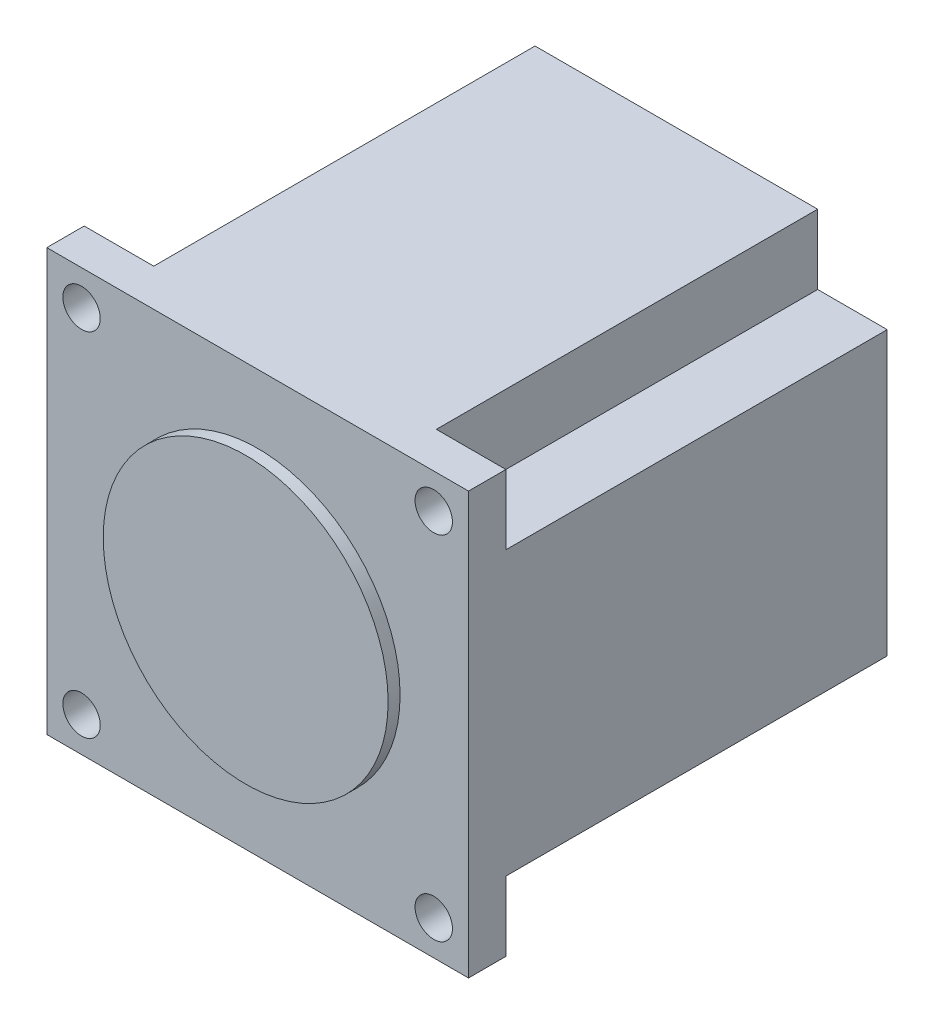
ISO-10303-21;
HEADER;
FILE_DESCRIPTION(('STEP AP214'),'2;1');
FILE_NAME('part.step','',(''),(''),'','','');
FILE_SCHEMA(('AUTOMOTIVE_DESIGN { 1 0 10303 214 1 1 1 1 }'));
ENDSEC;
DATA;
#1=APPLICATION_CONTEXT('core data for automotive mechanical design processes');
#2=APPLICATION_PROTOCOL_DEFINITION('international standard','automotive_design',2000,#1);
#3=PRODUCT_CONTEXT('',#1,'mechanical');
#4=PRODUCT('Part','Part','',(#3));
#5=PRODUCT_RELATED_PRODUCT_CATEGORY('part','',(#4));
#6=PRODUCT_DEFINITION_FORMATION('','',#4);
#7=PRODUCT_DEFINITION_CONTEXT('part definition',#1,'design');
#8=PRODUCT_DEFINITION('design','',#6,#7);
#9=PRODUCT_DEFINITION_SHAPE('','',#8);
#10=(LENGTH_UNIT() NAMED_UNIT(*) SI_UNIT(.MILLI.,.METRE.));
#11=(NAMED_UNIT(*) PLANE_ANGLE_UNIT() SI_UNIT($,.RADIAN.));
#12=(NAMED_UNIT(*) SI_UNIT($,.STERADIAN.) SOLID_ANGLE_UNIT());
#13=UNCERTAINTY_MEASURE_WITH_UNIT(LENGTH_MEASURE(1.E-05),#10,'distance_accuracy_value','');
#14=(GEOMETRIC_REPRESENTATION_CONTEXT(3) GLOBAL_UNCERTAINTY_ASSIGNED_CONTEXT((#13)) GLOBAL_UNIT_ASSIGNED_CONTEXT((#10,
#11,#12)) REPRESENTATION_CONTEXT('',''));
#15=CARTESIAN_POINT('',(0.,0.,0.));
#16=DIRECTION('',(0.,0.,1.));
#17=DIRECTION('',(1.,0.,0.));
#18=AXIS2_PLACEMENT_3D('',#15,#16,#17);
#19=CARTESIAN_POINT('',(-18.9,18.9,51.));
#20=DIRECTION('',(1.,0.,0.));
#21=DIRECTION('',(0.,1.,0.));
#22=AXIS2_PLACEMENT_3D('',#19,#20,#21);
#23=PLANE('',#22);
#24=DIRECTION('',(0.,-1.,0.));
#25=VECTOR('',#24,1.);
#26=CARTESIAN_POINT('',(-18.9,18.9,0.));
#27=LINE('',#26,#25);
#28=CARTESIAN_POINT('',(-18.9,28.2,0.));
#29=VERTEX_POINT('',#28);
#30=CARTESIAN_POINT('',(-18.9,18.9,0.));
#31=VERTEX_POINT('',#30);
#32=EDGE_CURVE('E193',#29,#31,#27,.T.);
#33=ORIENTED_EDGE('',*,*,#32,.T.);
#34=DIRECTION('',(0.,0.,-1.));
#35=VECTOR('',#34,1.);
#36=CARTESIAN_POINT('',(-18.9,18.9,51.));
#37=LINE('',#36,#35);
#38=CARTESIAN_POINT('',(-18.9,18.9,51.));
#39=VERTEX_POINT('',#38);
#40=EDGE_CURVE('E40',#39,#31,#37,.T.);
#41=ORIENTED_EDGE('',*,*,#40,.F.);
#42=DIRECTION('',(0.,-1.,0.));
#43=VECTOR('',#42,1.);
#44=CARTESIAN_POINT('',(-18.9,18.9,51.));
#45=LINE('',#44,#43);
#46=CARTESIAN_POINT('',(-18.9,28.2,51.));
#47=VERTEX_POINT('',#46);
#48=EDGE_CURVE('E194',#47,#39,#45,.T.);
#49=ORIENTED_EDGE('',*,*,#48,.F.);
#50=DIRECTION('',(0.,0.,-1.));
#51=VECTOR('',#50,1.);
#52=CARTESIAN_POINT('',(-18.9,28.2,51.));
#53=LINE('',#52,#51);
#54=EDGE_CURVE('E48',#47,#29,#53,.T.);
#55=ORIENTED_EDGE('',*,*,#54,.T.);
#56=EDGE_LOOP('',(#33,#41,#49,#55));
#57=FACE_BOUND('',#56,.T.);
#58=ADVANCED_FACE('F32',(#57),#23,.F.);
#59=CARTESIAN_POINT('',(-28.2,18.9,51.));
#60=DIRECTION('',(0.,-1.,0.));
#61=DIRECTION('',(0.,0.,-1.));
#62=AXIS2_PLACEMENT_3D('',#59,#60,#61);
#63=PLANE('',#62);
#64=DIRECTION('',(-1.,0.,0.));
#65=VECTOR('',#64,1.);
#66=CARTESIAN_POINT('',(-28.2,18.9,0.));
#67=LINE('',#66,#65);
#68=CARTESIAN_POINT('',(-28.2,18.9,0.));
#69=VERTEX_POINT('',#68);
#70=EDGE_CURVE('E212',#31,#69,#67,.T.);
#71=ORIENTED_EDGE('',*,*,#70,.T.);
#72=DIRECTION('',(0.,0.,-1.));
#73=VECTOR('',#72,1.);
#74=CARTESIAN_POINT('',(-28.2,18.9,51.));
#75=LINE('',#74,#73);
#76=CARTESIAN_POINT('',(-28.2,18.9,51.));
#77=VERTEX_POINT('',#76);
#78=EDGE_CURVE('E251',#77,#69,#75,.T.);
#79=ORIENTED_EDGE('',*,*,#78,.F.);
#80=DIRECTION('',(-1.,0.,0.));
#81=VECTOR('',#80,1.);
#82=CARTESIAN_POINT('',(-28.2,18.9,51.));
#83=LINE('',#82,#81);
#84=EDGE_CURVE('E103',#39,#77,#83,.T.);
#85=ORIENTED_EDGE('',*,*,#84,.F.);
#86=ORIENTED_EDGE('',*,*,#40,.T.);
#87=EDGE_LOOP('',(#71,#79,#85,#86));
#88=FACE_BOUND('',#87,.T.);
#89=ADVANCED_FACE('F253',(#88),#63,.F.);
#90=CARTESIAN_POINT('',(-28.2,-18.9,51.));
#91=DIRECTION('',(1.,0.,0.));
#92=DIRECTION('',(0.,0.,-1.));
#93=AXIS2_PLACEMENT_3D('',#90,#91,#92);
#94=PLANE('',#93);
#95=DIRECTION('',(0.,-1.,0.));
#96=VECTOR('',#95,1.);
#97=CARTESIAN_POINT('',(-28.2,-18.9,0.));
#98=LINE('',#97,#96);
#99=CARTESIAN_POINT('',(-28.2,-18.9,0.));
#100=VERTEX_POINT('',#99);
#101=EDGE_CURVE('E214',#69,#100,#98,.T.);
#102=ORIENTED_EDGE('',*,*,#101,.T.);
#103=DIRECTION('',(0.,0.,-1.));
#104=VECTOR('',#103,1.);
#105=CARTESIAN_POINT('',(-28.2,-18.9,51.));
#106=LINE('',#105,#104);
#107=CARTESIAN_POINT('',(-28.2,-18.9,51.));
#108=VERTEX_POINT('',#107);
#109=EDGE_CURVE('E248',#108,#100,#106,.T.);
#110=ORIENTED_EDGE('',*,*,#109,.F.);
#111=DIRECTION('',(0.,-1.,0.));
#112=VECTOR('',#111,1.);
#113=CARTESIAN_POINT('',(-28.2,-28.2,51.));
#114=LINE('',#113,#112);
#115=CARTESIAN_POINT('',(-28.2,-28.2,51.));
#116=VERTEX_POINT('',#115);
#117=EDGE_CURVE('E173',#108,#116,#114,.T.);
#118=ORIENTED_EDGE('',*,*,#117,.T.);
#119=DIRECTION('',(0.,0.,-1.));
#120=VECTOR('',#119,1.);
#121=CARTESIAN_POINT('',(-28.2,-28.2,56.));
#122=LINE('',#121,#120);
#123=CARTESIAN_POINT('',(-28.2,-28.2,56.));
#124=VERTEX_POINT('',#123);
#125=EDGE_CURVE('E185',#124,#116,#122,.T.);
#126=ORIENTED_EDGE('',*,*,#125,.F.);
#127=DIRECTION('',(0.,-1.,0.));
#128=VECTOR('',#127,1.);
#129=CARTESIAN_POINT('',(-28.2,-28.2,56.));
#130=LINE('',#129,#128);
#131=CARTESIAN_POINT('',(-28.2,28.2,56.));
#132=VERTEX_POINT('',#131);
#133=EDGE_CURVE('E292',#132,#124,#130,.T.);
#134=ORIENTED_EDGE('',*,*,#133,.F.);
#135=DIRECTION('',(0.,0.,-1.));
#136=VECTOR('',#135,1.);
#137=CARTESIAN_POINT('',(-28.2,28.2,56.));
#138=LINE('',#137,#136);
#139=CARTESIAN_POINT('',(-28.2,28.2,51.));
#140=VERTEX_POINT('',#139);
#141=EDGE_CURVE('E188',#132,#140,#138,.T.);
#142=ORIENTED_EDGE('',*,*,#141,.T.);
#143=EDGE_CURVE('E174',#140,#77,#114,.T.);
#144=ORIENTED_EDGE('',*,*,#143,.T.);
#145=ORIENTED_EDGE('',*,*,#78,.T.);
#146=EDGE_LOOP('',(#102,#110,#118,#126,#134,#142,#144,#145));
#147=FACE_BOUND('',#146,.T.);
#148=ADVANCED_FACE('F262',(#147),#94,.F.);
#149=CARTESIAN_POINT('',(-18.9,-18.9,51.));
#150=DIRECTION('',(0.,1.,0.));
#151=DIRECTION('',(0.,0.,1.));
#152=AXIS2_PLACEMENT_3D('',#149,#150,#151);
#153=PLANE('',#152);
#154=DIRECTION('',(1.,0.,0.));
#155=VECTOR('',#154,1.);
#156=CARTESIAN_POINT('',(-18.9,-18.9,0.));
#157=LINE('',#156,#155);
#158=CARTESIAN_POINT('',(-18.9,-18.9,0.));
#159=VERTEX_POINT('',#158);
#160=EDGE_CURVE('E216',#100,#159,#157,.T.);
#161=ORIENTED_EDGE('',*,*,#160,.T.);
#162=DIRECTION('',(0.,0.,-1.));
#163=VECTOR('',#162,1.);
#164=CARTESIAN_POINT('',(-18.9,-18.9,51.));
#165=LINE('',#164,#163);
#166=CARTESIAN_POINT('',(-18.9,-18.9,51.));
#167=VERTEX_POINT('',#166);
#168=EDGE_CURVE('E245',#167,#159,#165,.T.);
#169=ORIENTED_EDGE('',*,*,#168,.F.);
#170=DIRECTION('',(1.,0.,0.));
#171=VECTOR('',#170,1.);
#172=CARTESIAN_POINT('',(-18.9,-18.9,51.));
#173=LINE('',#172,#171);
#174=EDGE_CURVE('E198',#108,#167,#173,.T.);
#175=ORIENTED_EDGE('',*,*,#174,.F.);
#176=ORIENTED_EDGE('',*,*,#109,.T.);
#177=EDGE_LOOP('',(#161,#169,#175,#176));
#178=FACE_BOUND('',#177,.T.);
#179=ADVANCED_FACE('F266',(#178),#153,.F.);
#180=CARTESIAN_POINT('',(-18.9,-28.2,51.));
#181=DIRECTION('',(1.,0.,0.));
#182=DIRECTION('',(0.,0.,-1.));
#183=AXIS2_PLACEMENT_3D('',#180,#181,#182);
#184=PLANE('',#183);
#185=DIRECTION('',(0.,-1.,0.));
#186=VECTOR('',#185,1.);
#187=CARTESIAN_POINT('',(-18.9,-28.2,0.));
#188=LINE('',#187,#186);
#189=CARTESIAN_POINT('',(-18.9,-28.2,0.));
#190=VERTEX_POINT('',#189);
#191=EDGE_CURVE('E218',#159,#190,#188,.T.);
#192=ORIENTED_EDGE('',*,*,#191,.T.);
#193=DIRECTION('',(0.,0.,-1.));
#194=VECTOR('',#193,1.);
#195=CARTESIAN_POINT('',(-18.9,-28.2,51.));
#196=LINE('',#195,#194);
#197=CARTESIAN_POINT('',(-18.9,-28.2,51.));
#198=VERTEX_POINT('',#197);
#199=EDGE_CURVE('E242',#198,#190,#196,.T.);
#200=ORIENTED_EDGE('',*,*,#199,.F.);
#201=DIRECTION('',(0.,-1.,0.));
#202=VECTOR('',#201,1.);
#203=CARTESIAN_POINT('',(-18.9,-28.2,51.));
#204=LINE('',#203,#202);
#205=EDGE_CURVE('E201',#167,#198,#204,.T.);
#206=ORIENTED_EDGE('',*,*,#205,.F.);
#207=ORIENTED_EDGE('',*,*,#168,.T.);
#208=EDGE_LOOP('',(#192,#200,#206,#207));
#209=FACE_BOUND('',#208,.T.);
#210=ADVANCED_FACE('F372',(#209),#184,.F.);
#211=CARTESIAN_POINT('',(18.9,-28.2,51.));
#212=DIRECTION('',(0.,1.,0.));
#213=DIRECTION('',(0.,0.,1.));
#214=AXIS2_PLACEMENT_3D('',#211,#212,#213);
#215=PLANE('',#214);
#216=DIRECTION('',(1.,0.,0.));
#217=VECTOR('',#216,1.);
#218=CARTESIAN_POINT('',(18.9,-28.2,0.));
#219=LINE('',#218,#217);
#220=CARTESIAN_POINT('',(18.9,-28.2,0.));
#221=VERTEX_POINT('',#220);
#222=EDGE_CURVE('E220',#190,#221,#219,.T.);
#223=ORIENTED_EDGE('',*,*,#222,.T.);
#224=DIRECTION('',(0.,0.,-1.));
#225=VECTOR('',#224,1.);
#226=CARTESIAN_POINT('',(18.9,-28.2,51.));
#227=LINE('',#226,#225);
#228=CARTESIAN_POINT('',(18.9,-28.2,51.));
#229=VERTEX_POINT('',#228);
#230=EDGE_CURVE('E239',#229,#221,#227,.T.);
#231=ORIENTED_EDGE('',*,*,#230,.F.);
#232=DIRECTION('',(1.,0.,0.));
#233=VECTOR('',#232,1.);
#234=CARTESIAN_POINT('',(-28.2,-28.2,51.));
#235=LINE('',#234,#233);
#236=CARTESIAN_POINT('',(28.2,-28.2,51.));
#237=VERTEX_POINT('',#236);
#238=EDGE_CURVE('E177',#229,#237,#235,.T.);
#239=ORIENTED_EDGE('',*,*,#238,.T.);
#240=DIRECTION('',(0.,0.,-1.));
#241=VECTOR('',#240,1.);
#242=CARTESIAN_POINT('',(28.2,-28.2,56.));
#243=LINE('',#242,#241);
#244=CARTESIAN_POINT('',(28.2,-28.2,56.));
#245=VERTEX_POINT('',#244);
#246=EDGE_CURVE('E182',#245,#237,#243,.T.);
#247=ORIENTED_EDGE('',*,*,#246,.F.);
#248=DIRECTION('',(1.,0.,0.));
#249=VECTOR('',#248,1.);
#250=CARTESIAN_POINT('',(-28.2,-28.2,56.));
#251=LINE('',#250,#249);
#252=EDGE_CURVE('E170',#124,#245,#251,.T.);
#253=ORIENTED_EDGE('',*,*,#252,.F.);
#254=ORIENTED_EDGE('',*,*,#125,.T.);
#255=EDGE_CURVE('E178',#116,#198,#235,.T.);
#256=ORIENTED_EDGE('',*,*,#255,.T.);
#257=ORIENTED_EDGE('',*,*,#199,.T.);
#258=EDGE_LOOP('',(#223,#231,#239,#247,#253,#254,#256,#257));
#259=FACE_BOUND('',#258,.T.);
#260=ADVANCED_FACE('F281',(#259),#215,.F.);
#261=CARTESIAN_POINT('',(18.9,-18.9,51.));
#262=DIRECTION('',(-1.,0.,0.));
#263=DIRECTION('',(0.,0.,1.));
#264=AXIS2_PLACEMENT_3D('',#261,#262,#263);
#265=PLANE('',#264);
#266=DIRECTION('',(0.,1.,0.));
#267=VECTOR('',#266,1.);
#268=CARTESIAN_POINT('',(18.9,-18.9,0.));
#269=LINE('',#268,#267);
#270=CARTESIAN_POINT('',(18.9,-18.9,0.));
#271=VERTEX_POINT('',#270);
#272=EDGE_CURVE('E222',#221,#271,#269,.T.);
#273=ORIENTED_EDGE('',*,*,#272,.T.);
#274=DIRECTION('',(0.,0.,-1.));
#275=VECTOR('',#274,1.);
#276=CARTESIAN_POINT('',(18.9,-18.9,51.));
#277=LINE('',#276,#275);
#278=CARTESIAN_POINT('',(18.9,-18.9,51.));
#279=VERTEX_POINT('',#278);
#280=EDGE_CURVE('E236',#279,#271,#277,.T.);
#281=ORIENTED_EDGE('',*,*,#280,.F.);
#282=DIRECTION('',(0.,1.,0.));
#283=VECTOR('',#282,1.);
#284=CARTESIAN_POINT('',(18.9,-18.9,51.));
#285=LINE('',#284,#283);
#286=EDGE_CURVE('E204',#229,#279,#285,.T.);
#287=ORIENTED_EDGE('',*,*,#286,.F.);
#288=ORIENTED_EDGE('',*,*,#230,.T.);
#289=EDGE_LOOP('',(#273,#281,#287,#288));
#290=FACE_BOUND('',#289,.T.);
#291=ADVANCED_FACE('F378',(#290),#265,.F.);
#292=CARTESIAN_POINT('',(28.2,-18.9,51.));
#293=DIRECTION('',(0.,1.,0.));
#294=DIRECTION('',(0.,0.,1.));
#295=AXIS2_PLACEMENT_3D('',#292,#293,#294);
#296=PLANE('',#295);
#297=DIRECTION('',(1.,0.,0.));
#298=VECTOR('',#297,1.);
#299=CARTESIAN_POINT('',(28.2,-18.9,0.));
#300=LINE('',#299,#298);
#301=CARTESIAN_POINT('',(28.2,-18.9,0.));
#302=VERTEX_POINT('',#301);
#303=EDGE_CURVE('E224',#271,#302,#300,.T.);
#304=ORIENTED_EDGE('',*,*,#303,.T.);
#305=DIRECTION('',(0.,0.,-1.));
#306=VECTOR('',#305,1.);
#307=CARTESIAN_POINT('',(28.2,-18.9,51.));
#308=LINE('',#307,#306);
#309=CARTESIAN_POINT('',(28.2,-18.9,51.));
#310=VERTEX_POINT('',#309);
#311=EDGE_CURVE('E143',#310,#302,#308,.T.);
#312=ORIENTED_EDGE('',*,*,#311,.F.);
#313=DIRECTION('',(1.,0.,0.));
#314=VECTOR('',#313,1.);
#315=CARTESIAN_POINT('',(28.2,-18.9,51.));
#316=LINE('',#315,#314);
#317=EDGE_CURVE('E153',#279,#310,#316,.T.);
#318=ORIENTED_EDGE('',*,*,#317,.F.);
#319=ORIENTED_EDGE('',*,*,#280,.T.);
#320=EDGE_LOOP('',(#304,#312,#318,#319));
#321=FACE_BOUND('',#320,.T.);
#322=ADVANCED_FACE('F381',(#321),#296,.F.);
#323=CARTESIAN_POINT('',(28.2,18.9,51.));
#324=DIRECTION('',(-1.,0.,0.));
#325=DIRECTION('',(0.,0.,1.));
#326=AXIS2_PLACEMENT_3D('',#323,#324,#325);
#327=PLANE('',#326);
#328=DIRECTION('',(0.,1.,0.));
#329=VECTOR('',#328,1.);
#330=CARTESIAN_POINT('',(28.2,18.9,0.));
#331=LINE('',#330,#329);
#332=CARTESIAN_POINT('',(28.2,18.9,0.));
#333=VERTEX_POINT('',#332);
#334=EDGE_CURVE('E140',#302,#333,#331,.T.);
#335=ORIENTED_EDGE('',*,*,#334,.T.);
#336=DIRECTION('',(0.,0.,-1.));
#337=VECTOR('',#336,1.);
#338=CARTESIAN_POINT('',(28.2,18.9,51.));
#339=LINE('',#338,#337);
#340=CARTESIAN_POINT('',(28.2,18.9,51.));
#341=VERTEX_POINT('',#340);
#342=EDGE_CURVE('E130',#341,#333,#339,.T.);
#343=ORIENTED_EDGE('',*,*,#342,.F.);
#344=DIRECTION('',(0.,1.,0.));
#345=VECTOR('',#344,1.);
#346=CARTESIAN_POINT('',(28.2,-28.2,51.));
#347=LINE('',#346,#345);
#348=CARTESIAN_POINT('',(28.2,28.2,51.));
#349=VERTEX_POINT('',#348);
#350=EDGE_CURVE('E136',#341,#349,#347,.T.);
#351=ORIENTED_EDGE('',*,*,#350,.T.);
#352=DIRECTION('',(0.,0.,-1.));
#353=VECTOR('',#352,1.);
#354=CARTESIAN_POINT('',(28.2,28.2,56.));
#355=LINE('',#354,#353);
#356=CARTESIAN_POINT('',(28.2,28.2,56.));
#357=VERTEX_POINT('',#356);
#358=EDGE_CURVE('E191',#357,#349,#355,.T.);
#359=ORIENTED_EDGE('',*,*,#358,.F.);
#360=DIRECTION('',(0.,1.,0.));
#361=VECTOR('',#360,1.);
#362=CARTESIAN_POINT('',(28.2,-28.2,56.));
#363=LINE('',#362,#361);
#364=EDGE_CURVE('E181',#245,#357,#363,.T.);
#365=ORIENTED_EDGE('',*,*,#364,.F.);
#366=ORIENTED_EDGE('',*,*,#246,.T.);
#367=EDGE_CURVE('E160',#237,#310,#347,.T.);
#368=ORIENTED_EDGE('',*,*,#367,.T.);
#369=ORIENTED_EDGE('',*,*,#311,.T.);
#370=EDGE_LOOP('',(#335,#343,#351,#359,#365,#366,#368,#369));
#371=FACE_BOUND('',#370,.T.);
#372=ADVANCED_FACE('F132',(#371),#327,.F.);
#373=CARTESIAN_POINT('',(18.9,18.9,51.));
#374=DIRECTION('',(0.,-1.,0.));
#375=DIRECTION('',(0.,0.,-1.));
#376=AXIS2_PLACEMENT_3D('',#373,#374,#375);
#377=PLANE('',#376);
#378=DIRECTION('',(-1.,0.,0.));
#379=VECTOR('',#378,1.);
#380=CARTESIAN_POINT('',(18.9,18.9,0.));
#381=LINE('',#380,#379);
#382=CARTESIAN_POINT('',(18.9,18.9,0.));
#383=VERTEX_POINT('',#382);
#384=EDGE_CURVE('E227',#333,#383,#381,.T.);
#385=ORIENTED_EDGE('',*,*,#384,.T.);
#386=DIRECTION('',(0.,0.,-1.));
#387=VECTOR('',#386,1.);
#388=CARTESIAN_POINT('',(18.9,18.9,51.));
#389=LINE('',#388,#387);
#390=CARTESIAN_POINT('',(18.9,18.9,51.));
#391=VERTEX_POINT('',#390);
#392=EDGE_CURVE('E144',#391,#383,#389,.T.);
#393=ORIENTED_EDGE('',*,*,#392,.F.);
#394=DIRECTION('',(-1.,0.,0.));
#395=VECTOR('',#394,1.);
#396=CARTESIAN_POINT('',(18.9,18.9,51.));
#397=LINE('',#396,#395);
#398=EDGE_CURVE('E147',#341,#391,#397,.T.);
#399=ORIENTED_EDGE('',*,*,#398,.F.);
#400=ORIENTED_EDGE('',*,*,#342,.T.);
#401=EDGE_LOOP('',(#385,#393,#399,#400));
#402=FACE_BOUND('',#401,.T.);
#403=ADVANCED_FACE('F148',(#402),#377,.F.);
#404=CARTESIAN_POINT('',(18.9,28.2,51.));
#405=DIRECTION('',(-1.,0.,0.));
#406=DIRECTION('',(0.,-1.,0.));
#407=AXIS2_PLACEMENT_3D('',#404,#405,#406);
#408=PLANE('',#407);
#409=DIRECTION('',(0.,1.,0.));
#410=VECTOR('',#409,1.);
#411=CARTESIAN_POINT('',(18.9,28.2,0.));
#412=LINE('',#411,#410);
#413=CARTESIAN_POINT('',(18.9,28.2,0.));
#414=VERTEX_POINT('',#413);
#415=EDGE_CURVE('E91',#383,#414,#412,.T.);
#416=ORIENTED_EDGE('',*,*,#415,.T.);
#417=DIRECTION('',(0.,0.,-1.));
#418=VECTOR('',#417,1.);
#419=CARTESIAN_POINT('',(18.9,28.2,51.));
#420=LINE('',#419,#418);
#421=CARTESIAN_POINT('',(18.9,28.2,51.));
#422=VERTEX_POINT('',#421);
#423=EDGE_CURVE('E232',#422,#414,#420,.T.);
#424=ORIENTED_EDGE('',*,*,#423,.F.);
#425=DIRECTION('',(0.,1.,0.));
#426=VECTOR('',#425,1.);
#427=CARTESIAN_POINT('',(18.9,28.2,51.));
#428=LINE('',#427,#426);
#429=EDGE_CURVE('E152',#391,#422,#428,.T.);
#430=ORIENTED_EDGE('',*,*,#429,.F.);
#431=ORIENTED_EDGE('',*,*,#392,.T.);
#432=EDGE_LOOP('',(#416,#424,#430,#431));
#433=FACE_BOUND('',#432,.T.);
#434=ADVANCED_FACE('F390',(#433),#408,.F.);
#435=CARTESIAN_POINT('',(-18.9,28.2,51.));
#436=DIRECTION('',(0.,-1.,0.));
#437=DIRECTION('',(1.,0.,0.));
#438=AXIS2_PLACEMENT_3D('',#435,#436,#437);
#439=PLANE('',#438);
#440=DIRECTION('',(-1.,0.,0.));
#441=VECTOR('',#440,1.);
#442=CARTESIAN_POINT('',(-18.9,28.2,0.));
#443=LINE('',#442,#441);
#444=EDGE_CURVE('E95',#414,#29,#443,.T.);
#445=ORIENTED_EDGE('',*,*,#444,.T.);
#446=ORIENTED_EDGE('',*,*,#54,.F.);
#447=DIRECTION('',(-1.,0.,0.));
#448=VECTOR('',#447,1.);
#449=CARTESIAN_POINT('',(-28.2,28.2,51.));
#450=LINE('',#449,#448);
#451=EDGE_CURVE('E164',#47,#140,#450,.T.);
#452=ORIENTED_EDGE('',*,*,#451,.T.);
#453=ORIENTED_EDGE('',*,*,#141,.F.);
#454=DIRECTION('',(-1.,0.,0.));
#455=VECTOR('',#454,1.);
#456=CARTESIAN_POINT('',(-28.2,28.2,56.));
#457=LINE('',#456,#455);
#458=EDGE_CURVE('E293',#357,#132,#457,.T.);
#459=ORIENTED_EDGE('',*,*,#458,.F.);
#460=ORIENTED_EDGE('',*,*,#358,.T.);
#461=EDGE_CURVE('E158',#349,#422,#450,.T.);
#462=ORIENTED_EDGE('',*,*,#461,.T.);
#463=ORIENTED_EDGE('',*,*,#423,.T.);
#464=EDGE_LOOP('',(#445,#446,#452,#453,#459,#460,#462,#463));
#465=FACE_BOUND('',#464,.T.);
#466=ADVANCED_FACE('F393',(#465),#439,.F.);
#467=CARTESIAN_POINT('',(0.,0.,0.));
#468=DIRECTION('',(0.,0.,-1.));
#469=DIRECTION('',(-1.,0.,0.));
#470=AXIS2_PLACEMENT_3D('',#467,#468,#469);
#471=PLANE('',#470);
#472=ORIENTED_EDGE('',*,*,#32,.F.);
#473=ORIENTED_EDGE('',*,*,#444,.F.);
#474=ORIENTED_EDGE('',*,*,#415,.F.);
#475=ORIENTED_EDGE('',*,*,#384,.F.);
#476=ORIENTED_EDGE('',*,*,#334,.F.);
#477=ORIENTED_EDGE('',*,*,#303,.F.);
#478=ORIENTED_EDGE('',*,*,#272,.F.);
#479=ORIENTED_EDGE('',*,*,#222,.F.);
#480=ORIENTED_EDGE('',*,*,#191,.F.);
#481=ORIENTED_EDGE('',*,*,#160,.F.);
#482=ORIENTED_EDGE('',*,*,#101,.F.);
#483=ORIENTED_EDGE('',*,*,#70,.F.);
#484=EDGE_LOOP('',(#472,#473,#474,#475,#476,#477,#478,#479,#480,#481,#482,#483));
#485=FACE_BOUND('',#484,.T.);
#486=ADVANCED_FACE('F257',(#485),#471,.T.);
#487=CARTESIAN_POINT('',(0.,0.,51.));
#488=DIRECTION('',(0.,0.,-1.));
#489=DIRECTION('',(-1.,0.,0.));
#490=AXIS2_PLACEMENT_3D('',#487,#488,#489);
#491=PLANE('',#490);
#492=CARTESIAN_POINT('',(-23.55,23.55,51.));
#493=DIRECTION('',(0.,0.,1.));
#494=DIRECTION('',(1.,0.,0.));
#495=AXIS2_PLACEMENT_3D('',#492,#493,#494);
#496=CIRCLE('',#495,2.5);
#497=CARTESIAN_POINT('',(-21.05,23.55,51.));
#498=VERTEX_POINT('',#497);
#499=EDGE_CURVE('E166',#498,#498,#496,.T.);
#500=ORIENTED_EDGE('',*,*,#499,.T.);
#501=EDGE_LOOP('',(#500));
#502=FACE_BOUND('',#501,.T.);
#503=ORIENTED_EDGE('',*,*,#451,.F.);
#504=ORIENTED_EDGE('',*,*,#48,.T.);
#505=ORIENTED_EDGE('',*,*,#84,.T.);
#506=ORIENTED_EDGE('',*,*,#143,.F.);
#507=EDGE_LOOP('',(#503,#504,#505,#506));
#508=FACE_BOUND('',#507,.T.);
#509=ADVANCED_FACE('F352',(#502,#508),#491,.T.);
#510=CARTESIAN_POINT('',(-23.55,-23.55,51.));
#511=DIRECTION('',(0.,0.,1.));
#512=DIRECTION('',(1.,0.,0.));
#513=AXIS2_PLACEMENT_3D('',#510,#511,#512);
#514=CIRCLE('',#513,2.5);
#515=CARTESIAN_POINT('',(-21.05,-23.55,51.));
#516=VERTEX_POINT('',#515);
#517=EDGE_CURVE('E313',#516,#516,#514,.T.);
#518=ORIENTED_EDGE('',*,*,#517,.T.);
#519=EDGE_LOOP('',(#518));
#520=FACE_BOUND('',#519,.T.);
#521=ORIENTED_EDGE('',*,*,#117,.F.);
#522=ORIENTED_EDGE('',*,*,#174,.T.);
#523=ORIENTED_EDGE('',*,*,#205,.T.);
#524=ORIENTED_EDGE('',*,*,#255,.F.);
#525=EDGE_LOOP('',(#521,#522,#523,#524));
#526=FACE_BOUND('',#525,.T.);
#527=ADVANCED_FACE('F271',(#520,#526),#491,.T.);
#528=CARTESIAN_POINT('',(23.55,-23.55,51.));
#529=DIRECTION('',(0.,0.,1.));
#530=DIRECTION('',(1.,0.,0.));
#531=AXIS2_PLACEMENT_3D('',#528,#529,#530);
#532=CIRCLE('',#531,2.5);
#533=CARTESIAN_POINT('',(26.05,-23.55,51.));
#534=VERTEX_POINT('',#533);
#535=EDGE_CURVE('E307',#534,#534,#532,.T.);
#536=ORIENTED_EDGE('',*,*,#535,.T.);
#537=EDGE_LOOP('',(#536));
#538=FACE_BOUND('',#537,.T.);
#539=ORIENTED_EDGE('',*,*,#238,.F.);
#540=ORIENTED_EDGE('',*,*,#286,.T.);
#541=ORIENTED_EDGE('',*,*,#317,.T.);
#542=ORIENTED_EDGE('',*,*,#367,.F.);
#543=EDGE_LOOP('',(#539,#540,#541,#542));
#544=FACE_BOUND('',#543,.T.);
#545=ADVANCED_FACE('F333',(#538,#544),#491,.T.);
#546=CARTESIAN_POINT('',(0.,0.,56.));
#547=DIRECTION('',(0.,0.,-1.));
#548=DIRECTION('',(-1.,0.,0.));
#549=AXIS2_PLACEMENT_3D('',#546,#547,#548);
#550=PLANE('',#549);
#551=CARTESIAN_POINT('',(0.,0.,56.));
#552=DIRECTION('',(0.,0.,-1.));
#553=DIRECTION('',(-1.,0.,0.));
#554=AXIS2_PLACEMENT_3D('',#551,#552,#553);
#555=CIRCLE('',#554,19.05);
#556=CARTESIAN_POINT('',(-19.05,0.,56.));
#557=VERTEX_POINT('',#556);
#558=EDGE_CURVE('E11',#557,#557,#555,.F.);
#559=ORIENTED_EDGE('',*,*,#558,.F.);
#560=EDGE_LOOP('',(#559));
#561=FACE_BOUND('',#560,.T.);
#562=ORIENTED_EDGE('',*,*,#364,.T.);
#563=ORIENTED_EDGE('',*,*,#458,.T.);
#564=ORIENTED_EDGE('',*,*,#133,.T.);
#565=ORIENTED_EDGE('',*,*,#252,.T.);
#566=EDGE_LOOP('',(#562,#563,#564,#565));
#567=FACE_BOUND('',#566,.T.);
#568=CARTESIAN_POINT('',(-23.55,23.55,56.));
#569=DIRECTION('',(0.,0.,1.));
#570=DIRECTION('',(1.,0.,0.));
#571=AXIS2_PLACEMENT_3D('',#568,#569,#570);
#572=CIRCLE('',#571,2.5);
#573=CARTESIAN_POINT('',(-21.05,23.55,56.));
#574=VERTEX_POINT('',#573);
#575=EDGE_CURVE('E161',#574,#574,#572,.T.);
#576=ORIENTED_EDGE('',*,*,#575,.F.);
#577=EDGE_LOOP('',(#576));
#578=FACE_BOUND('',#577,.T.);
#579=CARTESIAN_POINT('',(23.55,23.55,56.));
#580=DIRECTION('',(0.,0.,1.));
#581=DIRECTION('',(1.,0.,0.));
#582=AXIS2_PLACEMENT_3D('',#579,#580,#581);
#583=CIRCLE('',#582,2.5);
#584=CARTESIAN_POINT('',(26.05,23.55,56.));
#585=VERTEX_POINT('',#584);
#586=EDGE_CURVE('E299',#585,#585,#583,.T.);
#587=ORIENTED_EDGE('',*,*,#586,.F.);
#588=EDGE_LOOP('',(#587));
#589=FACE_BOUND('',#588,.T.);
#590=CARTESIAN_POINT('',(23.55,-23.55,56.));
#591=DIRECTION('',(0.,0.,1.));
#592=DIRECTION('',(1.,0.,0.));
#593=AXIS2_PLACEMENT_3D('',#590,#591,#592);
#594=CIRCLE('',#593,2.5);
#595=CARTESIAN_POINT('',(26.05,-23.55,56.));
#596=VERTEX_POINT('',#595);
#597=EDGE_CURVE('E304',#596,#596,#594,.T.);
#598=ORIENTED_EDGE('',*,*,#597,.F.);
#599=EDGE_LOOP('',(#598));
#600=FACE_BOUND('',#599,.T.);
#601=CARTESIAN_POINT('',(-23.55,-23.55,56.));
#602=DIRECTION('',(0.,0.,1.));
#603=DIRECTION('',(1.,0.,0.));
#604=AXIS2_PLACEMENT_3D('',#601,#602,#603);
#605=CIRCLE('',#604,2.5);
#606=CARTESIAN_POINT('',(-21.05,-23.55,56.));
#607=VERTEX_POINT('',#606);
#608=EDGE_CURVE('E310',#607,#607,#605,.T.);
#609=ORIENTED_EDGE('',*,*,#608,.F.);
#610=EDGE_LOOP('',(#609));
#611=FACE_BOUND('',#610,.T.);
#612=ADVANCED_FACE('F331',(#561,#567,#578,#589,#600,#611),#550,.F.);
#613=ORIENTED_EDGE('',*,*,#350,.F.);
#614=ORIENTED_EDGE('',*,*,#398,.T.);
#615=ORIENTED_EDGE('',*,*,#429,.T.);
#616=ORIENTED_EDGE('',*,*,#461,.F.);
#617=EDGE_LOOP('',(#613,#614,#615,#616));
#618=FACE_BOUND('',#617,.T.);
#619=CARTESIAN_POINT('',(23.55,23.55,51.));
#620=DIRECTION('',(0.,0.,1.));
#621=DIRECTION('',(1.,0.,0.));
#622=AXIS2_PLACEMENT_3D('',#619,#620,#621);
#623=CIRCLE('',#622,2.5);
#624=CARTESIAN_POINT('',(26.05,23.55,51.));
#625=VERTEX_POINT('',#624);
#626=EDGE_CURVE('E301',#625,#625,#623,.T.);
#627=ORIENTED_EDGE('',*,*,#626,.T.);
#628=EDGE_LOOP('',(#627));
#629=FACE_BOUND('',#628,.T.);
#630=ADVANCED_FACE('F155',(#618,#629),#491,.T.);
#631=CARTESIAN_POINT('',(-23.55,23.55,56.));
#632=DIRECTION('',(0.,0.,-1.));
#633=DIRECTION('',(-1.,0.,0.));
#634=AXIS2_PLACEMENT_3D('',#631,#632,#633);
#635=CYLINDRICAL_SURFACE('',#634,2.5);
#636=ORIENTED_EDGE('',*,*,#575,.T.);
#637=EDGE_LOOP('',(#636));
#638=FACE_BOUND('',#637,.T.);
#639=ORIENTED_EDGE('',*,*,#499,.F.);
#640=EDGE_LOOP('',(#639));
#641=FACE_BOUND('',#640,.T.);
#642=ADVANCED_FACE('F427',(#638,#641),#635,.F.);
#643=CARTESIAN_POINT('',(23.55,23.55,56.));
#644=DIRECTION('',(0.,0.,-1.));
#645=DIRECTION('',(-1.,0.,0.));
#646=AXIS2_PLACEMENT_3D('',#643,#644,#645);
#647=CYLINDRICAL_SURFACE('',#646,2.5);
#648=ORIENTED_EDGE('',*,*,#586,.T.);
#649=EDGE_LOOP('',(#648));
#650=FACE_BOUND('',#649,.T.);
#651=ORIENTED_EDGE('',*,*,#626,.F.);
#652=EDGE_LOOP('',(#651));
#653=FACE_BOUND('',#652,.T.);
#654=ADVANCED_FACE('F435',(#650,#653),#647,.F.);
#655=CARTESIAN_POINT('',(23.55,-23.55,56.));
#656=DIRECTION('',(0.,0.,-1.));
#657=DIRECTION('',(-1.,0.,0.));
#658=AXIS2_PLACEMENT_3D('',#655,#656,#657);
#659=CYLINDRICAL_SURFACE('',#658,2.5);
#660=ORIENTED_EDGE('',*,*,#597,.T.);
#661=EDGE_LOOP('',(#660));
#662=FACE_BOUND('',#661,.T.);
#663=ORIENTED_EDGE('',*,*,#535,.F.);
#664=EDGE_LOOP('',(#663));
#665=FACE_BOUND('',#664,.T.);
#666=ADVANCED_FACE('F347',(#662,#665),#659,.F.);
#667=CARTESIAN_POINT('',(-23.55,-23.55,56.));
#668=DIRECTION('',(0.,0.,-1.));
#669=DIRECTION('',(-1.,0.,0.));
#670=AXIS2_PLACEMENT_3D('',#667,#668,#669);
#671=CYLINDRICAL_SURFACE('',#670,2.5);
#672=ORIENTED_EDGE('',*,*,#608,.T.);
#673=EDGE_LOOP('',(#672));
#674=FACE_BOUND('',#673,.T.);
#675=ORIENTED_EDGE('',*,*,#517,.F.);
#676=EDGE_LOOP('',(#675));
#677=FACE_BOUND('',#676,.T.);
#678=ADVANCED_FACE('F327',(#674,#677),#671,.F.);
#679=CARTESIAN_POINT('',(0.,0.,57.6));
#680=DIRECTION('',(0.,0.,-1.));
#681=DIRECTION('',(-1.,0.,0.));
#682=AXIS2_PLACEMENT_3D('',#679,#680,#681);
#683=CYLINDRICAL_SURFACE('',#682,19.05);
#684=CARTESIAN_POINT('',(0.,0.,57.6));
#685=DIRECTION('',(0.,0.,1.));
#686=DIRECTION('',(1.,0.,0.));
#687=AXIS2_PLACEMENT_3D('',#684,#685,#686);
#688=CIRCLE('',#687,19.05);
#689=CARTESIAN_POINT('',(19.05,0.,57.6));
#690=VERTEX_POINT('',#689);
#691=EDGE_CURVE('E316',#690,#690,#688,.T.);
#692=ORIENTED_EDGE('',*,*,#691,.F.);
#693=EDGE_LOOP('',(#692));
#694=FACE_BOUND('',#693,.T.);
#695=ORIENTED_EDGE('',*,*,#558,.T.);
#696=EDGE_LOOP('',(#695));
#697=FACE_BOUND('',#696,.T.);
#698=ADVANCED_FACE('F324',(#694,#697),#683,.T.);
#699=CARTESIAN_POINT('',(0.,0.,57.6));
#700=DIRECTION('',(0.,0.,1.));
#701=DIRECTION('',(1.,0.,0.));
#702=AXIS2_PLACEMENT_3D('',#699,#700,#701);
#703=PLANE('',#702);
#704=ORIENTED_EDGE('',*,*,#691,.T.);
#705=EDGE_LOOP('',(#704));
#706=FACE_BOUND('',#705,.T.);
#707=ADVANCED_FACE('F322',(#706),#703,.T.);
#708=CLOSED_SHELL('',(#58,#89,#148,#179,#210,#260,#291,#322,#372,#403,#434,#466,#486,#509,#527,
#545,#612,#630,#642,#654,#666,#678,#698,#707));
#709=MANIFOLD_SOLID_BREP('B2',#708);
#710=ADVANCED_BREP_SHAPE_REPRESENTATION('',(#18,#709),#14);
#711=SHAPE_DEFINITION_REPRESENTATION(#9,#710);
ENDSEC;
END-ISO-10303-21;
